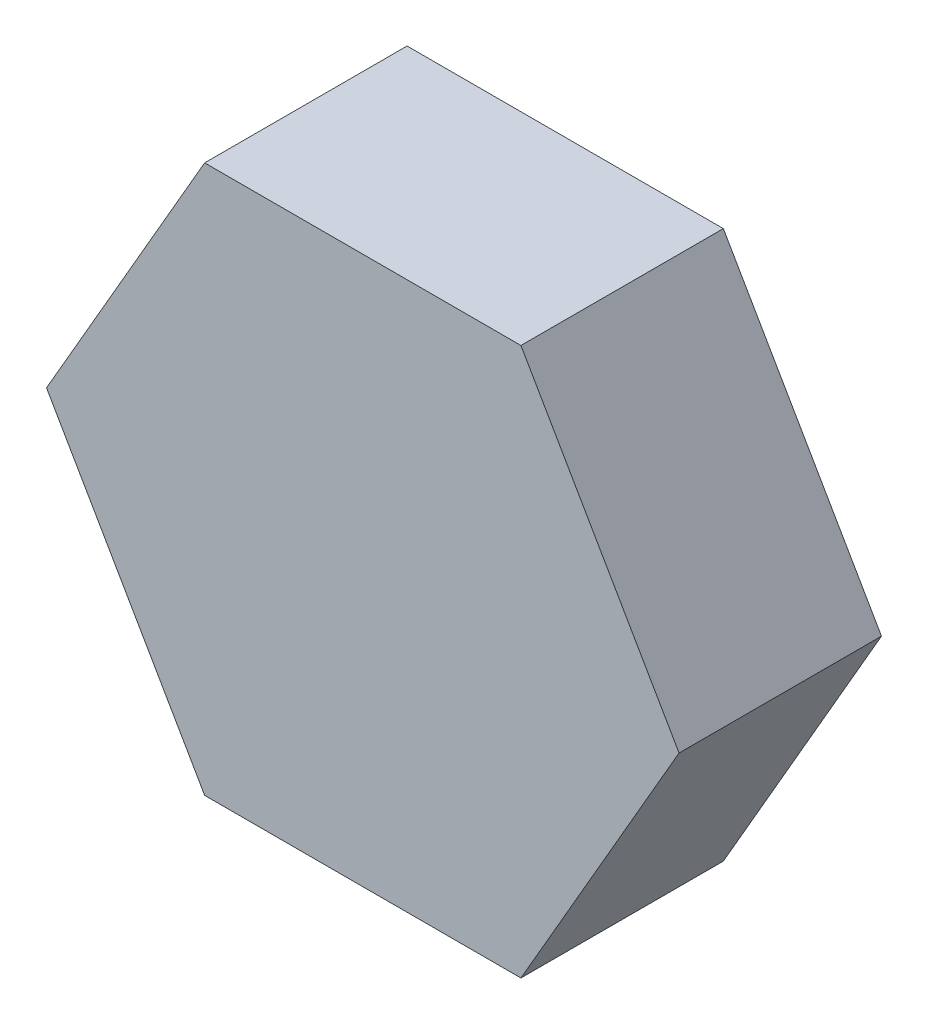
ISO-10303-21;
HEADER;
FILE_DESCRIPTION(('STEP AP214'),'2;1');
FILE_NAME('part.step','',(''),(''),'','','');
FILE_SCHEMA(('AUTOMOTIVE_DESIGN { 1 0 10303 214 1 1 1 1 }'));
ENDSEC;
DATA;
#1=APPLICATION_CONTEXT('core data for automotive mechanical design processes');
#2=APPLICATION_PROTOCOL_DEFINITION('international standard','automotive_design',2000,#1);
#3=PRODUCT_CONTEXT('',#1,'mechanical');
#4=PRODUCT('Part','Part','',(#3));
#5=PRODUCT_RELATED_PRODUCT_CATEGORY('part','',(#4));
#6=PRODUCT_DEFINITION_FORMATION('','',#4);
#7=PRODUCT_DEFINITION_CONTEXT('part definition',#1,'design');
#8=PRODUCT_DEFINITION('design','',#6,#7);
#9=PRODUCT_DEFINITION_SHAPE('','',#8);
#10=(LENGTH_UNIT() NAMED_UNIT(*) SI_UNIT(.MILLI.,.METRE.));
#11=(NAMED_UNIT(*) PLANE_ANGLE_UNIT() SI_UNIT($,.RADIAN.));
#12=(NAMED_UNIT(*) SI_UNIT($,.STERADIAN.) SOLID_ANGLE_UNIT());
#13=UNCERTAINTY_MEASURE_WITH_UNIT(LENGTH_MEASURE(1.E-05),#10,'distance_accuracy_value','');
#14=(GEOMETRIC_REPRESENTATION_CONTEXT(3) GLOBAL_UNCERTAINTY_ASSIGNED_CONTEXT((#13)) GLOBAL_UNIT_ASSIGNED_CONTEXT((#10,
#11,#12)) REPRESENTATION_CONTEXT('',''));
#15=CARTESIAN_POINT('',(0.,0.,0.));
#16=DIRECTION('',(0.,0.,1.));
#17=DIRECTION('',(1.,0.,0.));
#18=AXIS2_PLACEMENT_3D('',#15,#16,#17);
#19=CARTESIAN_POINT('',(18.75,-32.4759526419165,24.));
#20=DIRECTION('',(-0.866025403784439,0.5,0.));
#21=DIRECTION('',(-0.5,-0.866025403784439,0.));
#22=AXIS2_PLACEMENT_3D('',#19,#20,#21);
#23=PLANE('',#22);
#24=DIRECTION('',(0.5,0.866025403784439,0.));
#25=VECTOR('',#24,1.);
#26=CARTESIAN_POINT('',(18.75,-32.4759526419165,0.));
#27=LINE('',#26,#25);
#28=CARTESIAN_POINT('',(18.75,-32.4759526419165,0.));
#29=VERTEX_POINT('',#28);
#30=CARTESIAN_POINT('',(37.5,0.,0.));
#31=VERTEX_POINT('',#30);
#32=EDGE_CURVE('E115',#29,#31,#27,.T.);
#33=ORIENTED_EDGE('',*,*,#32,.T.);
#34=DIRECTION('',(0.,0.,-1.));
#35=VECTOR('',#34,1.);
#36=CARTESIAN_POINT('',(37.5,0.,24.));
#37=LINE('',#36,#35);
#38=CARTESIAN_POINT('',(37.5,0.,24.));
#39=VERTEX_POINT('',#38);
#40=EDGE_CURVE('E11',#39,#31,#37,.T.);
#41=ORIENTED_EDGE('',*,*,#40,.F.);
#42=DIRECTION('',(0.5,0.866025403784439,0.));
#43=VECTOR('',#42,1.);
#44=CARTESIAN_POINT('',(18.75,-32.4759526419165,24.));
#45=LINE('',#44,#43);
#46=CARTESIAN_POINT('',(18.75,-32.4759526419165,24.));
#47=VERTEX_POINT('',#46);
#48=EDGE_CURVE('E125',#47,#39,#45,.T.);
#49=ORIENTED_EDGE('',*,*,#48,.F.);
#50=DIRECTION('',(0.,0.,-1.));
#51=VECTOR('',#50,1.);
#52=CARTESIAN_POINT('',(18.75,-32.4759526419165,24.));
#53=LINE('',#52,#51);
#54=EDGE_CURVE('E111',#47,#29,#53,.T.);
#55=ORIENTED_EDGE('',*,*,#54,.T.);
#56=EDGE_LOOP('',(#33,#41,#49,#55));
#57=FACE_BOUND('',#56,.T.);
#58=ADVANCED_FACE('F31',(#57),#23,.F.);
#59=CARTESIAN_POINT('',(37.5,0.,24.));
#60=DIRECTION('',(-0.866025403784438,-0.5,0.));
#61=DIRECTION('',(0.5,-0.866025403784438,0.));
#62=AXIS2_PLACEMENT_3D('',#59,#60,#61);
#63=PLANE('',#62);
#64=DIRECTION('',(-0.5,0.866025403784438,0.));
#65=VECTOR('',#64,1.);
#66=CARTESIAN_POINT('',(37.5,0.,0.));
#67=LINE('',#66,#65);
#68=CARTESIAN_POINT('',(18.75,32.4759526419165,0.));
#69=VERTEX_POINT('',#68);
#70=EDGE_CURVE('E118',#31,#69,#67,.T.);
#71=ORIENTED_EDGE('',*,*,#70,.T.);
#72=DIRECTION('',(0.,0.,-1.));
#73=VECTOR('',#72,1.);
#74=CARTESIAN_POINT('',(18.75,32.4759526419165,24.));
#75=LINE('',#74,#73);
#76=CARTESIAN_POINT('',(18.75,32.4759526419165,24.));
#77=VERTEX_POINT('',#76);
#78=EDGE_CURVE('E39',#77,#69,#75,.T.);
#79=ORIENTED_EDGE('',*,*,#78,.F.);
#80=DIRECTION('',(-0.5,0.866025403784438,0.));
#81=VECTOR('',#80,1.);
#82=CARTESIAN_POINT('',(37.5,0.,24.));
#83=LINE('',#82,#81);
#84=EDGE_CURVE('E84',#39,#77,#83,.T.);
#85=ORIENTED_EDGE('',*,*,#84,.F.);
#86=ORIENTED_EDGE('',*,*,#40,.T.);
#87=EDGE_LOOP('',(#71,#79,#85,#86));
#88=FACE_BOUND('',#87,.T.);
#89=ADVANCED_FACE('F149',(#88),#63,.F.);
#90=CARTESIAN_POINT('',(18.75,32.4759526419165,24.));
#91=DIRECTION('',(0.,-1.,0.));
#92=DIRECTION('',(0.,0.,-1.));
#93=AXIS2_PLACEMENT_3D('',#90,#91,#92);
#94=PLANE('',#93);
#95=DIRECTION('',(-1.,0.,0.));
#96=VECTOR('',#95,1.);
#97=CARTESIAN_POINT('',(18.75,32.4759526419165,0.));
#98=LINE('',#97,#96);
#99=CARTESIAN_POINT('',(-18.75,32.4759526419165,0.));
#100=VERTEX_POINT('',#99);
#101=EDGE_CURVE('E120',#69,#100,#98,.T.);
#102=ORIENTED_EDGE('',*,*,#101,.T.);
#103=DIRECTION('',(0.,0.,-1.));
#104=VECTOR('',#103,1.);
#105=CARTESIAN_POINT('',(-18.75,32.4759526419165,24.));
#106=LINE('',#105,#104);
#107=CARTESIAN_POINT('',(-18.75,32.4759526419165,24.));
#108=VERTEX_POINT('',#107);
#109=EDGE_CURVE('E106',#108,#100,#106,.T.);
#110=ORIENTED_EDGE('',*,*,#109,.F.);
#111=DIRECTION('',(-1.,0.,0.));
#112=VECTOR('',#111,1.);
#113=CARTESIAN_POINT('',(18.75,32.4759526419165,24.));
#114=LINE('',#113,#112);
#115=EDGE_CURVE('E97',#77,#108,#114,.T.);
#116=ORIENTED_EDGE('',*,*,#115,.F.);
#117=ORIENTED_EDGE('',*,*,#78,.T.);
#118=EDGE_LOOP('',(#102,#110,#116,#117));
#119=FACE_BOUND('',#118,.T.);
#120=ADVANCED_FACE('F131',(#119),#94,.F.);
#121=CARTESIAN_POINT('',(-18.75,32.4759526419165,24.));
#122=DIRECTION('',(0.866025403784438,-0.5,0.));
#123=DIRECTION('',(0.5,0.866025403784439,0.));
#124=AXIS2_PLACEMENT_3D('',#121,#122,#123);
#125=PLANE('',#124);
#126=DIRECTION('',(-0.5,-0.866025403784439,0.));
#127=VECTOR('',#126,1.);
#128=CARTESIAN_POINT('',(-18.75,32.4759526419165,0.));
#129=LINE('',#128,#127);
#130=CARTESIAN_POINT('',(-37.5,0.,0.));
#131=VERTEX_POINT('',#130);
#132=EDGE_CURVE('E105',#100,#131,#129,.T.);
#133=ORIENTED_EDGE('',*,*,#132,.T.);
#134=DIRECTION('',(0.,0.,-1.));
#135=VECTOR('',#134,1.);
#136=CARTESIAN_POINT('',(-37.5,0.,24.));
#137=LINE('',#136,#135);
#138=CARTESIAN_POINT('',(-37.5,0.,24.));
#139=VERTEX_POINT('',#138);
#140=EDGE_CURVE('E102',#139,#131,#137,.T.);
#141=ORIENTED_EDGE('',*,*,#140,.F.);
#142=DIRECTION('',(-0.5,-0.866025403784439,0.));
#143=VECTOR('',#142,1.);
#144=CARTESIAN_POINT('',(-18.75,32.4759526419165,24.));
#145=LINE('',#144,#143);
#146=EDGE_CURVE('E91',#108,#139,#145,.T.);
#147=ORIENTED_EDGE('',*,*,#146,.F.);
#148=ORIENTED_EDGE('',*,*,#109,.T.);
#149=EDGE_LOOP('',(#133,#141,#147,#148));
#150=FACE_BOUND('',#149,.T.);
#151=ADVANCED_FACE('F103',(#150),#125,.F.);
#152=CARTESIAN_POINT('',(-37.5,0.,24.));
#153=DIRECTION('',(0.866025403784438,0.5,0.));
#154=DIRECTION('',(-0.5,0.866025403784439,0.));
#155=AXIS2_PLACEMENT_3D('',#152,#153,#154);
#156=PLANE('',#155);
#157=DIRECTION('',(0.5,-0.866025403784438,0.));
#158=VECTOR('',#157,1.);
#159=CARTESIAN_POINT('',(-37.5,0.,0.));
#160=LINE('',#159,#158);
#161=CARTESIAN_POINT('',(-18.75,-32.4759526419165,0.));
#162=VERTEX_POINT('',#161);
#163=EDGE_CURVE('E70',#131,#162,#160,.T.);
#164=ORIENTED_EDGE('',*,*,#163,.T.);
#165=DIRECTION('',(0.,0.,-1.));
#166=VECTOR('',#165,1.);
#167=CARTESIAN_POINT('',(-18.75,-32.4759526419165,24.));
#168=LINE('',#167,#166);
#169=CARTESIAN_POINT('',(-18.75,-32.4759526419165,24.));
#170=VERTEX_POINT('',#169);
#171=EDGE_CURVE('E107',#170,#162,#168,.T.);
#172=ORIENTED_EDGE('',*,*,#171,.F.);
#173=DIRECTION('',(0.5,-0.866025403784438,0.));
#174=VECTOR('',#173,1.);
#175=CARTESIAN_POINT('',(-37.5,0.,24.));
#176=LINE('',#175,#174);
#177=EDGE_CURVE('E95',#139,#170,#176,.T.);
#178=ORIENTED_EDGE('',*,*,#177,.F.);
#179=ORIENTED_EDGE('',*,*,#140,.T.);
#180=EDGE_LOOP('',(#164,#172,#178,#179));
#181=FACE_BOUND('',#180,.T.);
#182=ADVANCED_FACE('F109',(#181),#156,.F.);
#183=CARTESIAN_POINT('',(-18.75,-32.4759526419165,24.));
#184=DIRECTION('',(0.,1.,0.));
#185=DIRECTION('',(0.,0.,1.));
#186=AXIS2_PLACEMENT_3D('',#183,#184,#185);
#187=PLANE('',#186);
#188=DIRECTION('',(1.,0.,0.));
#189=VECTOR('',#188,1.);
#190=CARTESIAN_POINT('',(-18.75,-32.4759526419165,0.));
#191=LINE('',#190,#189);
#192=EDGE_CURVE('E76',#162,#29,#191,.T.);
#193=ORIENTED_EDGE('',*,*,#192,.T.);
#194=ORIENTED_EDGE('',*,*,#54,.F.);
#195=DIRECTION('',(1.,0.,0.));
#196=VECTOR('',#195,1.);
#197=CARTESIAN_POINT('',(-18.75,-32.4759526419165,24.));
#198=LINE('',#197,#196);
#199=EDGE_CURVE('E47',#170,#47,#198,.T.);
#200=ORIENTED_EDGE('',*,*,#199,.F.);
#201=ORIENTED_EDGE('',*,*,#171,.T.);
#202=EDGE_LOOP('',(#193,#194,#200,#201));
#203=FACE_BOUND('',#202,.T.);
#204=ADVANCED_FACE('F138',(#203),#187,.F.);
#205=CARTESIAN_POINT('',(37.5,0.,24.));
#206=DIRECTION('',(0.,0.,1.));
#207=DIRECTION('',(1.,0.,0.));
#208=AXIS2_PLACEMENT_3D('',#205,#206,#207);
#209=PLANE('',#208);
#210=ORIENTED_EDGE('',*,*,#48,.T.);
#211=ORIENTED_EDGE('',*,*,#84,.T.);
#212=ORIENTED_EDGE('',*,*,#115,.T.);
#213=ORIENTED_EDGE('',*,*,#146,.T.);
#214=ORIENTED_EDGE('',*,*,#177,.T.);
#215=ORIENTED_EDGE('',*,*,#199,.T.);
#216=EDGE_LOOP('',(#210,#211,#212,#213,#214,#215));
#217=FACE_BOUND('',#216,.T.);
#218=ADVANCED_FACE('F93',(#217),#209,.T.);
#219=CARTESIAN_POINT('',(37.5,0.,0.));
#220=DIRECTION('',(0.,0.,1.));
#221=DIRECTION('',(1.,0.,0.));
#222=AXIS2_PLACEMENT_3D('',#219,#220,#221);
#223=PLANE('',#222);
#224=ORIENTED_EDGE('',*,*,#32,.F.);
#225=ORIENTED_EDGE('',*,*,#192,.F.);
#226=ORIENTED_EDGE('',*,*,#163,.F.);
#227=ORIENTED_EDGE('',*,*,#132,.F.);
#228=ORIENTED_EDGE('',*,*,#101,.F.);
#229=ORIENTED_EDGE('',*,*,#70,.F.);
#230=EDGE_LOOP('',(#224,#225,#226,#227,#228,#229));
#231=FACE_BOUND('',#230,.T.);
#232=ADVANCED_FACE('F134',(#231),#223,.F.);
#233=CLOSED_SHELL('',(#58,#89,#120,#151,#182,#204,#218,#232));
#234=MANIFOLD_SOLID_BREP('B2',#233);
#235=ADVANCED_BREP_SHAPE_REPRESENTATION('',(#18,#234),#14);
#236=SHAPE_DEFINITION_REPRESENTATION(#9,#235);
ENDSEC;
END-ISO-10303-21;
